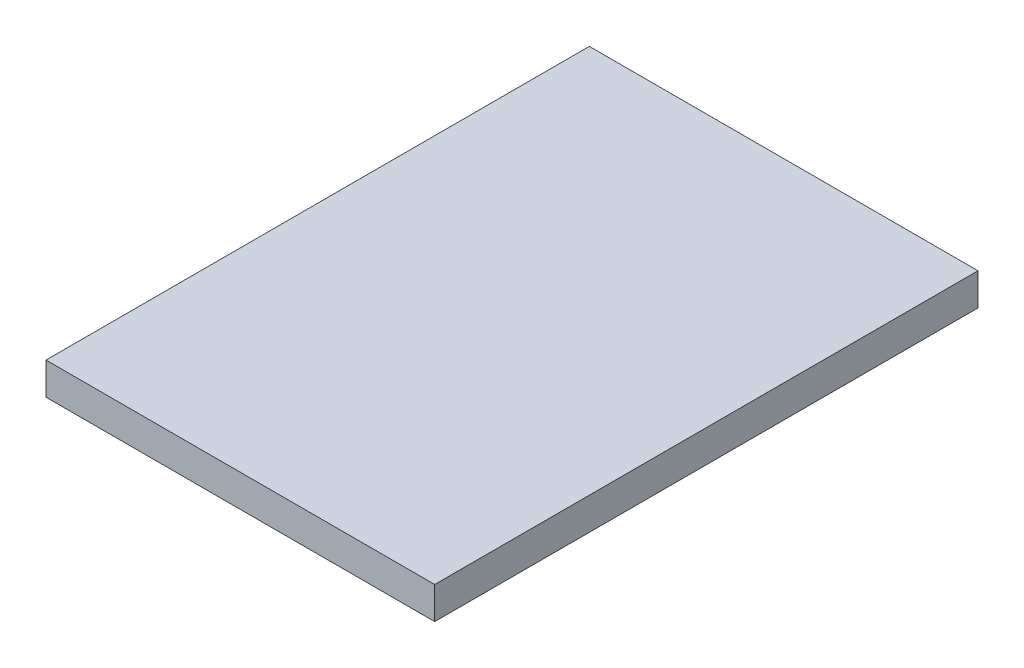
ISO-10303-21;
HEADER;
FILE_DESCRIPTION(('STEP AP214'),'2;1');
FILE_NAME('part.step','',(''),(''),'','','');
FILE_SCHEMA(('AUTOMOTIVE_DESIGN { 1 0 10303 214 1 1 1 1 }'));
ENDSEC;
DATA;
#1=APPLICATION_CONTEXT('core data for automotive mechanical design processes');
#2=APPLICATION_PROTOCOL_DEFINITION('international standard','automotive_design',2000,#1);
#3=PRODUCT_CONTEXT('',#1,'mechanical');
#4=PRODUCT('Part','Part','',(#3));
#5=PRODUCT_RELATED_PRODUCT_CATEGORY('part','',(#4));
#6=PRODUCT_DEFINITION_FORMATION('','',#4);
#7=PRODUCT_DEFINITION_CONTEXT('part definition',#1,'design');
#8=PRODUCT_DEFINITION('design','',#6,#7);
#9=PRODUCT_DEFINITION_SHAPE('','',#8);
#10=(LENGTH_UNIT() NAMED_UNIT(*) SI_UNIT(.MILLI.,.METRE.));
#11=(NAMED_UNIT(*) PLANE_ANGLE_UNIT() SI_UNIT($,.RADIAN.));
#12=(NAMED_UNIT(*) SI_UNIT($,.STERADIAN.) SOLID_ANGLE_UNIT());
#13=UNCERTAINTY_MEASURE_WITH_UNIT(LENGTH_MEASURE(1.E-05),#10,'distance_accuracy_value','');
#14=(GEOMETRIC_REPRESENTATION_CONTEXT(3) GLOBAL_UNCERTAINTY_ASSIGNED_CONTEXT((#13)) GLOBAL_UNIT_ASSIGNED_CONTEXT((#10,
#11,#12)) REPRESENTATION_CONTEXT('',''));
#15=CARTESIAN_POINT('',(0.,0.,0.));
#16=DIRECTION('',(0.,0.,1.));
#17=DIRECTION('',(1.,0.,0.));
#18=AXIS2_PLACEMENT_3D('',#15,#16,#17);
#19=CARTESIAN_POINT('',(9.3,1.54,13.));
#20=DIRECTION('',(-1.,0.,0.));
#21=DIRECTION('',(0.,0.,1.));
#22=AXIS2_PLACEMENT_3D('',#19,#20,#21);
#23=PLANE('',#22);
#24=DIRECTION('',(0.,0.,-1.));
#25=VECTOR('',#24,1.);
#26=CARTESIAN_POINT('',(9.3,0.,13.));
#27=LINE('',#26,#25);
#28=CARTESIAN_POINT('',(9.3,0.,13.));
#29=VERTEX_POINT('',#28);
#30=CARTESIAN_POINT('',(9.3,0.,-13.));
#31=VERTEX_POINT('',#30);
#32=EDGE_CURVE('E98',#29,#31,#27,.T.);
#33=ORIENTED_EDGE('',*,*,#32,.T.);
#34=DIRECTION('',(0.,-1.,0.));
#35=VECTOR('',#34,1.);
#36=CARTESIAN_POINT('',(9.3,1.54,-13.));
#37=LINE('',#36,#35);
#38=CARTESIAN_POINT('',(9.3,1.54,-13.));
#39=VERTEX_POINT('',#38);
#40=EDGE_CURVE('E11',#39,#31,#37,.T.);
#41=ORIENTED_EDGE('',*,*,#40,.F.);
#42=DIRECTION('',(0.,0.,-1.));
#43=VECTOR('',#42,1.);
#44=CARTESIAN_POINT('',(9.3,1.54,13.));
#45=LINE('',#44,#43);
#46=CARTESIAN_POINT('',(9.3,1.54,13.));
#47=VERTEX_POINT('',#46);
#48=EDGE_CURVE('E86',#47,#39,#45,.T.);
#49=ORIENTED_EDGE('',*,*,#48,.F.);
#50=DIRECTION('',(0.,-1.,0.));
#51=VECTOR('',#50,1.);
#52=CARTESIAN_POINT('',(9.3,1.54,13.));
#53=LINE('',#52,#51);
#54=EDGE_CURVE('E94',#47,#29,#53,.T.);
#55=ORIENTED_EDGE('',*,*,#54,.T.);
#56=EDGE_LOOP('',(#33,#41,#49,#55));
#57=FACE_BOUND('',#56,.T.);
#58=ADVANCED_FACE('F35',(#57),#23,.F.);
#59=CARTESIAN_POINT('',(-9.3,1.54,-13.));
#60=DIRECTION('',(0.,0.,1.));
#61=DIRECTION('',(1.,0.,0.));
#62=AXIS2_PLACEMENT_3D('',#59,#60,#61);
#63=PLANE('',#62);
#64=DIRECTION('',(-1.,0.,0.));
#65=VECTOR('',#64,1.);
#66=CARTESIAN_POINT('',(-9.3,0.,-13.));
#67=LINE('',#66,#65);
#68=CARTESIAN_POINT('',(-9.3,0.,-13.));
#69=VERTEX_POINT('',#68);
#70=EDGE_CURVE('E90',#31,#69,#67,.T.);
#71=ORIENTED_EDGE('',*,*,#70,.T.);
#72=DIRECTION('',(0.,-1.,0.));
#73=VECTOR('',#72,1.);
#74=CARTESIAN_POINT('',(-9.3,1.54,-13.));
#75=LINE('',#74,#73);
#76=CARTESIAN_POINT('',(-9.3,1.54,-13.));
#77=VERTEX_POINT('',#76);
#78=EDGE_CURVE('E43',#77,#69,#75,.T.);
#79=ORIENTED_EDGE('',*,*,#78,.F.);
#80=DIRECTION('',(-1.,0.,0.));
#81=VECTOR('',#80,1.);
#82=CARTESIAN_POINT('',(-9.3,1.54,-13.));
#83=LINE('',#82,#81);
#84=EDGE_CURVE('E81',#39,#77,#83,.T.);
#85=ORIENTED_EDGE('',*,*,#84,.F.);
#86=ORIENTED_EDGE('',*,*,#40,.T.);
#87=EDGE_LOOP('',(#71,#79,#85,#86));
#88=FACE_BOUND('',#87,.T.);
#89=ADVANCED_FACE('F89',(#88),#63,.F.);
#90=CARTESIAN_POINT('',(-9.3,1.54,13.));
#91=DIRECTION('',(1.,0.,0.));
#92=DIRECTION('',(0.,0.,-1.));
#93=AXIS2_PLACEMENT_3D('',#90,#91,#92);
#94=PLANE('',#93);
#95=DIRECTION('',(0.,0.,1.));
#96=VECTOR('',#95,1.);
#97=CARTESIAN_POINT('',(-9.3,0.,13.));
#98=LINE('',#97,#96);
#99=CARTESIAN_POINT('',(-9.3,0.,13.));
#100=VERTEX_POINT('',#99);
#101=EDGE_CURVE('E68',#69,#100,#98,.T.);
#102=ORIENTED_EDGE('',*,*,#101,.T.);
#103=DIRECTION('',(0.,-1.,0.));
#104=VECTOR('',#103,1.);
#105=CARTESIAN_POINT('',(-9.3,1.54,13.));
#106=LINE('',#105,#104);
#107=CARTESIAN_POINT('',(-9.3,1.54,13.));
#108=VERTEX_POINT('',#107);
#109=EDGE_CURVE('E91',#108,#100,#106,.T.);
#110=ORIENTED_EDGE('',*,*,#109,.F.);
#111=DIRECTION('',(0.,0.,1.));
#112=VECTOR('',#111,1.);
#113=CARTESIAN_POINT('',(-9.3,1.54,13.));
#114=LINE('',#113,#112);
#115=EDGE_CURVE('E84',#77,#108,#114,.T.);
#116=ORIENTED_EDGE('',*,*,#115,.F.);
#117=ORIENTED_EDGE('',*,*,#78,.T.);
#118=EDGE_LOOP('',(#102,#110,#116,#117));
#119=FACE_BOUND('',#118,.T.);
#120=ADVANCED_FACE('F92',(#119),#94,.F.);
#121=CARTESIAN_POINT('',(-9.3,1.54,13.));
#122=DIRECTION('',(0.,0.,-1.));
#123=DIRECTION('',(-1.,0.,0.));
#124=AXIS2_PLACEMENT_3D('',#121,#122,#123);
#125=PLANE('',#124);
#126=DIRECTION('',(1.,0.,0.));
#127=VECTOR('',#126,1.);
#128=CARTESIAN_POINT('',(-9.3,0.,13.));
#129=LINE('',#128,#127);
#130=EDGE_CURVE('E74',#100,#29,#129,.T.);
#131=ORIENTED_EDGE('',*,*,#130,.T.);
#132=ORIENTED_EDGE('',*,*,#54,.F.);
#133=DIRECTION('',(1.,0.,0.));
#134=VECTOR('',#133,1.);
#135=CARTESIAN_POINT('',(-9.3,1.54,13.));
#136=LINE('',#135,#134);
#137=EDGE_CURVE('E51',#108,#47,#136,.T.);
#138=ORIENTED_EDGE('',*,*,#137,.F.);
#139=ORIENTED_EDGE('',*,*,#109,.T.);
#140=EDGE_LOOP('',(#131,#132,#138,#139));
#141=FACE_BOUND('',#140,.T.);
#142=ADVANCED_FACE('F105',(#141),#125,.F.);
#143=CARTESIAN_POINT('',(0.,1.54,0.));
#144=DIRECTION('',(0.,-1.,0.));
#145=DIRECTION('',(0.,0.,-1.));
#146=AXIS2_PLACEMENT_3D('',#143,#144,#145);
#147=PLANE('',#146);
#148=ORIENTED_EDGE('',*,*,#48,.T.);
#149=ORIENTED_EDGE('',*,*,#84,.T.);
#150=ORIENTED_EDGE('',*,*,#115,.T.);
#151=ORIENTED_EDGE('',*,*,#137,.T.);
#152=EDGE_LOOP('',(#148,#149,#150,#151));
#153=FACE_BOUND('',#152,.T.);
#154=ADVANCED_FACE('F82',(#153),#147,.F.);
#155=CARTESIAN_POINT('',(0.,0.,0.));
#156=DIRECTION('',(0.,-1.,0.));
#157=DIRECTION('',(0.,0.,-1.));
#158=AXIS2_PLACEMENT_3D('',#155,#156,#157);
#159=PLANE('',#158);
#160=ORIENTED_EDGE('',*,*,#32,.F.);
#161=ORIENTED_EDGE('',*,*,#130,.F.);
#162=ORIENTED_EDGE('',*,*,#101,.F.);
#163=ORIENTED_EDGE('',*,*,#70,.F.);
#164=EDGE_LOOP('',(#160,#161,#162,#163));
#165=FACE_BOUND('',#164,.T.);
#166=ADVANCED_FACE('F108',(#165),#159,.T.);
#167=CLOSED_SHELL('',(#58,#89,#120,#142,#154,#166));
#168=MANIFOLD_SOLID_BREP('B2',#167);
#169=ADVANCED_BREP_SHAPE_REPRESENTATION('',(#18,#168),#14);
#170=SHAPE_DEFINITION_REPRESENTATION(#9,#169);
ENDSEC;
END-ISO-10303-21;
